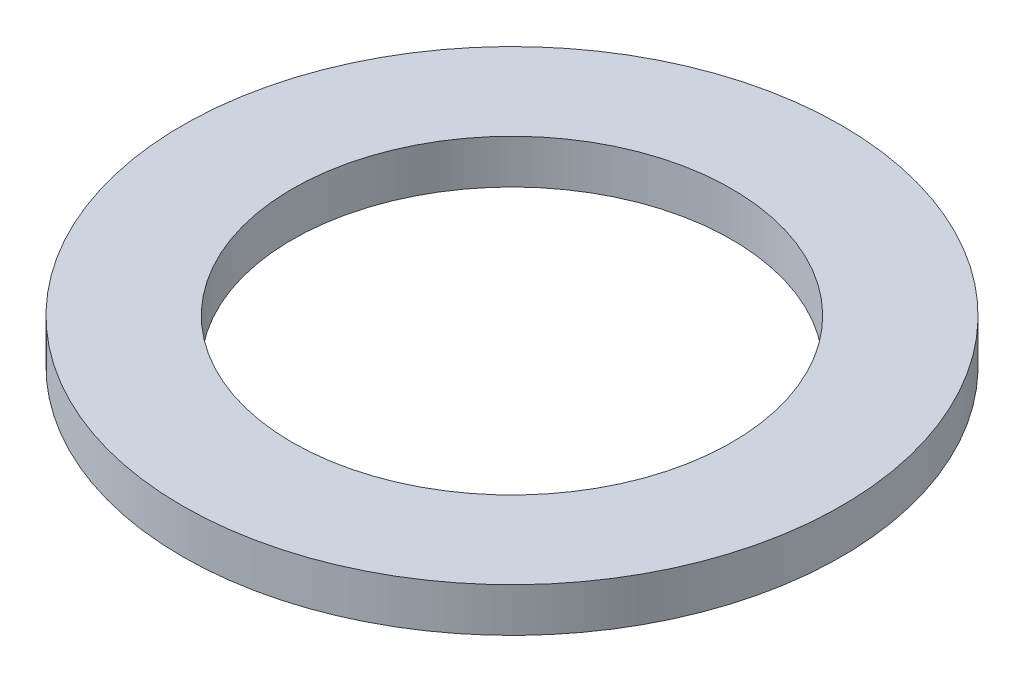
ISO-10303-21;
HEADER;
FILE_DESCRIPTION(('STEP AP214'),'2;1');
FILE_NAME('part.step','',(''),(''),'','','');
FILE_SCHEMA(('AUTOMOTIVE_DESIGN { 1 0 10303 214 1 1 1 1 }'));
ENDSEC;
DATA;
#1=APPLICATION_CONTEXT('core data for automotive mechanical design processes');
#2=APPLICATION_PROTOCOL_DEFINITION('international standard','automotive_design',2000,#1);
#3=PRODUCT_CONTEXT('',#1,'mechanical');
#4=PRODUCT('Part','Part','',(#3));
#5=PRODUCT_RELATED_PRODUCT_CATEGORY('part','',(#4));
#6=PRODUCT_DEFINITION_FORMATION('','',#4);
#7=PRODUCT_DEFINITION_CONTEXT('part definition',#1,'design');
#8=PRODUCT_DEFINITION('design','',#6,#7);
#9=PRODUCT_DEFINITION_SHAPE('','',#8);
#10=(LENGTH_UNIT() NAMED_UNIT(*) SI_UNIT(.MILLI.,.METRE.));
#11=(NAMED_UNIT(*) PLANE_ANGLE_UNIT() SI_UNIT($,.RADIAN.));
#12=(NAMED_UNIT(*) SI_UNIT($,.STERADIAN.) SOLID_ANGLE_UNIT());
#13=UNCERTAINTY_MEASURE_WITH_UNIT(LENGTH_MEASURE(1.E-05),#10,'distance_accuracy_value','');
#14=(GEOMETRIC_REPRESENTATION_CONTEXT(3) GLOBAL_UNCERTAINTY_ASSIGNED_CONTEXT((#13)) GLOBAL_UNIT_ASSIGNED_CONTEXT((#10,
#11,#12)) REPRESENTATION_CONTEXT('',''));
#15=CARTESIAN_POINT('',(0.,0.,0.));
#16=DIRECTION('',(0.,0.,1.));
#17=DIRECTION('',(1.,0.,0.));
#18=AXIS2_PLACEMENT_3D('',#15,#16,#17);
#19=CARTESIAN_POINT('',(0.,2.,0.));
#20=DIRECTION('',(0.,1.,0.));
#21=DIRECTION('',(0.,0.,1.));
#22=AXIS2_PLACEMENT_3D('',#19,#20,#21);
#23=PLANE('',#22);
#24=CARTESIAN_POINT('',(0.,2.,0.));
#25=DIRECTION('',(0.,1.,0.));
#26=DIRECTION('',(0.,0.,1.));
#27=AXIS2_PLACEMENT_3D('',#24,#25,#26);
#28=CIRCLE('',#27,15.);
#29=CARTESIAN_POINT('',(0.,2.,15.));
#30=VERTEX_POINT('',#29);
#31=EDGE_CURVE('E10',#30,#30,#28,.T.);
#32=ORIENTED_EDGE('',*,*,#31,.T.);
#33=EDGE_LOOP('',(#32));
#34=FACE_BOUND('',#33,.T.);
#35=CARTESIAN_POINT('',(0.,2.,0.));
#36=DIRECTION('',(0.,1.,0.));
#37=DIRECTION('',(0.,0.,1.));
#38=AXIS2_PLACEMENT_3D('',#35,#36,#37);
#39=CIRCLE('',#38,10.);
#40=CARTESIAN_POINT('',(0.,2.,10.));
#41=VERTEX_POINT('',#40);
#42=EDGE_CURVE('E54',#41,#41,#39,.T.);
#43=ORIENTED_EDGE('',*,*,#42,.F.);
#44=EDGE_LOOP('',(#43));
#45=FACE_BOUND('',#44,.T.);
#46=ADVANCED_FACE('F41',(#34,#45),#23,.T.);
#47=CARTESIAN_POINT('',(0.,0.,0.));
#48=DIRECTION('',(0.,1.,0.));
#49=DIRECTION('',(0.,0.,1.));
#50=AXIS2_PLACEMENT_3D('',#47,#48,#49);
#51=PLANE('',#50);
#52=CARTESIAN_POINT('',(0.,0.,0.));
#53=DIRECTION('',(0.,1.,0.));
#54=DIRECTION('',(0.,0.,1.));
#55=AXIS2_PLACEMENT_3D('',#52,#53,#54);
#56=CIRCLE('',#55,15.);
#57=CARTESIAN_POINT('',(0.,0.,15.));
#58=VERTEX_POINT('',#57);
#59=EDGE_CURVE('E45',#58,#58,#56,.T.);
#60=ORIENTED_EDGE('',*,*,#59,.F.);
#61=EDGE_LOOP('',(#60));
#62=FACE_BOUND('',#61,.T.);
#63=CARTESIAN_POINT('',(0.,0.,0.));
#64=DIRECTION('',(0.,1.,0.));
#65=DIRECTION('',(0.,0.,1.));
#66=AXIS2_PLACEMENT_3D('',#63,#64,#65);
#67=CIRCLE('',#66,10.);
#68=CARTESIAN_POINT('',(0.,0.,10.));
#69=VERTEX_POINT('',#68);
#70=EDGE_CURVE('E56',#69,#69,#67,.T.);
#71=ORIENTED_EDGE('',*,*,#70,.T.);
#72=EDGE_LOOP('',(#71));
#73=FACE_BOUND('',#72,.T.);
#74=ADVANCED_FACE('F68',(#62,#73),#51,.F.);
#75=CARTESIAN_POINT('',(0.,2.,0.));
#76=DIRECTION('',(0.,-1.,0.));
#77=DIRECTION('',(0.,0.,-1.));
#78=AXIS2_PLACEMENT_3D('',#75,#76,#77);
#79=CYLINDRICAL_SURFACE('',#78,15.);
#80=ORIENTED_EDGE('',*,*,#31,.F.);
#81=EDGE_LOOP('',(#80));
#82=FACE_BOUND('',#81,.T.);
#83=ORIENTED_EDGE('',*,*,#59,.T.);
#84=EDGE_LOOP('',(#83));
#85=FACE_BOUND('',#84,.T.);
#86=ADVANCED_FACE('F43',(#82,#85),#79,.T.);
#87=CARTESIAN_POINT('',(0.,2.,0.));
#88=DIRECTION('',(0.,-1.,0.));
#89=DIRECTION('',(0.,0.,-1.));
#90=AXIS2_PLACEMENT_3D('',#87,#88,#89);
#91=CYLINDRICAL_SURFACE('',#90,10.);
#92=ORIENTED_EDGE('',*,*,#42,.T.);
#93=EDGE_LOOP('',(#92));
#94=FACE_BOUND('',#93,.T.);
#95=ORIENTED_EDGE('',*,*,#70,.F.);
#96=EDGE_LOOP('',(#95));
#97=FACE_BOUND('',#96,.T.);
#98=ADVANCED_FACE('F64',(#94,#97),#91,.F.);
#99=CLOSED_SHELL('',(#46,#74,#86,#98));
#100=MANIFOLD_SOLID_BREP('B2',#99);
#101=ADVANCED_BREP_SHAPE_REPRESENTATION('',(#18,#100),#14);
#102=SHAPE_DEFINITION_REPRESENTATION(#9,#101);
ENDSEC;
END-ISO-10303-21;
